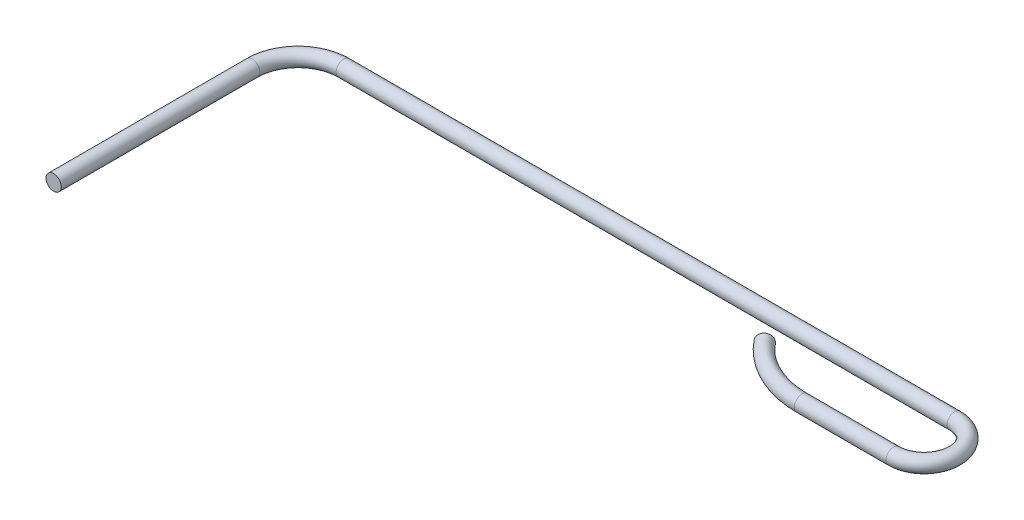
ISO-10303-21;
HEADER;
FILE_DESCRIPTION(('STEP AP214'),'2;1');
FILE_NAME('part.step','',(''),(''),'','','');
FILE_SCHEMA(('AUTOMOTIVE_DESIGN { 1 0 10303 214 1 1 1 1 }'));
ENDSEC;
DATA;
#1=APPLICATION_CONTEXT('core data for automotive mechanical design processes');
#2=APPLICATION_PROTOCOL_DEFINITION('international standard','automotive_design',2000,#1);
#3=PRODUCT_CONTEXT('',#1,'mechanical');
#4=PRODUCT('Part','Part','',(#3));
#5=PRODUCT_RELATED_PRODUCT_CATEGORY('part','',(#4));
#6=PRODUCT_DEFINITION_FORMATION('','',#4);
#7=PRODUCT_DEFINITION_CONTEXT('part definition',#1,'design');
#8=PRODUCT_DEFINITION('design','',#6,#7);
#9=PRODUCT_DEFINITION_SHAPE('','',#8);
#10=(LENGTH_UNIT() NAMED_UNIT(*) SI_UNIT(.MILLI.,.METRE.));
#11=(NAMED_UNIT(*) PLANE_ANGLE_UNIT() SI_UNIT($,.RADIAN.));
#12=(NAMED_UNIT(*) SI_UNIT($,.STERADIAN.) SOLID_ANGLE_UNIT());
#13=UNCERTAINTY_MEASURE_WITH_UNIT(LENGTH_MEASURE(1.E-05),#10,'distance_accuracy_value','');
#14=(GEOMETRIC_REPRESENTATION_CONTEXT(3) GLOBAL_UNCERTAINTY_ASSIGNED_CONTEXT((#13)) GLOBAL_UNIT_ASSIGNED_CONTEXT((#10,
#11,#12)) REPRESENTATION_CONTEXT('',''));
#15=CARTESIAN_POINT('',(0.,0.,0.));
#16=DIRECTION('',(0.,0.,1.));
#17=DIRECTION('',(1.,0.,0.));
#18=AXIS2_PLACEMENT_3D('',#15,#16,#17);
#19=CARTESIAN_POINT('',(0.,0.,0.));
#20=DIRECTION('',(0.,0.,1.));
#21=DIRECTION('',(1.,0.,0.));
#22=AXIS2_PLACEMENT_3D('',#19,#20,#21);
#23=PLANE('',#22);
#24=CARTESIAN_POINT('',(0.,0.,0.));
#25=DIRECTION('',(0.,0.,1.));
#26=DIRECTION('',(1.,0.,0.));
#27=AXIS2_PLACEMENT_3D('',#24,#25,#26);
#28=CIRCLE('',#27,2.5);
#29=CARTESIAN_POINT('',(2.5,0.,0.));
#30=VERTEX_POINT('',#29);
#31=EDGE_CURVE('E56',#30,#30,#28,.T.);
#32=ORIENTED_EDGE('',*,*,#31,.T.);
#33=EDGE_LOOP('',(#32));
#34=FACE_BOUND('',#33,.T.);
#35=ADVANCED_FACE('F31',(#34),#23,.T.);
#36=CARTESIAN_POINT('',(161.616073533188,0.,-71.2065973545311));
#37=DIRECTION('',(0.626446754848964,0.,0.779464215560408));
#38=DIRECTION('',(0.779464215560407,0.,-0.626446754848964));
#39=AXIS2_PLACEMENT_3D('',#36,#37,#38);
#40=PLANE('',#39);
#41=CARTESIAN_POINT('',(161.616073533188,0.,-71.2065973545311));
#42=DIRECTION('',(0.626446754848964,0.,0.779464215560408));
#43=DIRECTION('',(0.779464215560407,0.,-0.626446754848964));
#44=AXIS2_PLACEMENT_3D('',#41,#42,#43);
#45=CIRCLE('',#44,2.5);
#46=CARTESIAN_POINT('',(159.667412994287,0.,-69.6404804674086));
#47=VERTEX_POINT('',#46);
#48=EDGE_CURVE('E10',#47,#47,#45,.T.);
#49=ORIENTED_EDGE('',*,*,#48,.F.);
#50=EDGE_LOOP('',(#49));
#51=FACE_BOUND('',#50,.T.);
#52=ADVANCED_FACE('F64',(#51),#40,.F.);
#53=CARTESIAN_POINT('',(0.,0.,0.));
#54=DIRECTION('',(0.,0.,-1.));
#55=DIRECTION('',(-1.,0.,0.));
#56=AXIS2_PLACEMENT_3D('',#53,#54,#55);
#57=CYLINDRICAL_SURFACE('',#56,2.5);
#58=CARTESIAN_POINT('',(0.,0.,-65.));
#59=DIRECTION('',(0.,0.,1.));
#60=DIRECTION('',(1.,0.,0.));
#61=AXIS2_PLACEMENT_3D('',#58,#59,#60);
#62=CIRCLE('',#61,2.5);
#63=CARTESIAN_POINT('',(-2.5,0.,-65.));
#64=VERTEX_POINT('',#63);
#65=EDGE_CURVE('E53',#64,#64,#62,.T.);
#66=ORIENTED_EDGE('',*,*,#65,.T.);
#67=EDGE_LOOP('',(#66));
#68=FACE_BOUND('',#67,.T.);
#69=ORIENTED_EDGE('',*,*,#31,.F.);
#70=EDGE_LOOP('',(#69));
#71=FACE_BOUND('',#70,.T.);
#72=ADVANCED_FACE('F61',(#68,#71),#57,.T.);
#73=CARTESIAN_POINT('',(15.,0.,-65.));
#74=DIRECTION('',(0.,-1.,0.));
#75=DIRECTION('',(0.,0.,-1.));
#76=AXIS2_PLACEMENT_3D('',#73,#74,#75);
#77=TOROIDAL_SURFACE('',#76,15.,2.5);
#78=CARTESIAN_POINT('',(15.,0.,-80.));
#79=DIRECTION('',(-1.,0.,0.));
#80=DIRECTION('',(0.,0.,1.));
#81=AXIS2_PLACEMENT_3D('',#78,#79,#80);
#82=CIRCLE('',#81,2.5);
#83=CARTESIAN_POINT('',(15.,0.,-82.5));
#84=VERTEX_POINT('',#83);
#85=EDGE_CURVE('E50',#84,#84,#82,.T.);
#86=CARTESIAN_POINT('',(15.,0.,-65.));
#87=DIRECTION('',(0.,-1.,0.));
#88=DIRECTION('',(0.,0.,-1.));
#89=AXIS2_PLACEMENT_3D('',#86,#87,#88);
#90=CIRCLE('',#89,17.5);
#91=EDGE_CURVE('',#64,#84,#90,.T.);
#92=ORIENTED_EDGE('',*,*,#65,.F.);
#93=ORIENTED_EDGE('',*,*,#85,.T.);
#94=ORIENTED_EDGE('',*,*,#91,.T.);
#95=ORIENTED_EDGE('',*,*,#91,.F.);
#96=EDGE_LOOP('',(#92,#94,#93,#95));
#97=FACE_BOUND('',#96,.T.);
#98=ADVANCED_FACE('F63',(#97),#77,.T.);
#99=CARTESIAN_POINT('',(15.,0.,-80.));
#100=DIRECTION('',(1.,0.,0.));
#101=DIRECTION('',(0.,0.,-1.));
#102=AXIS2_PLACEMENT_3D('',#99,#100,#101);
#103=CYLINDRICAL_SURFACE('',#102,2.5);
#104=CARTESIAN_POINT('',(215.,0.,-80.));
#105=DIRECTION('',(-1.,0.,0.));
#106=DIRECTION('',(0.,0.,1.));
#107=AXIS2_PLACEMENT_3D('',#104,#105,#106);
#108=CIRCLE('',#107,2.5);
#109=CARTESIAN_POINT('',(215.,0.,-82.5));
#110=VERTEX_POINT('',#109);
#111=EDGE_CURVE('E45',#110,#110,#108,.T.);
#112=ORIENTED_EDGE('',*,*,#111,.T.);
#113=EDGE_LOOP('',(#112));
#114=FACE_BOUND('',#113,.T.);
#115=ORIENTED_EDGE('',*,*,#85,.F.);
#116=EDGE_LOOP('',(#115));
#117=FACE_BOUND('',#116,.T.);
#118=ADVANCED_FACE('F71',(#114,#117),#103,.T.);
#119=CARTESIAN_POINT('',(215.,0.,-70.));
#120=DIRECTION('',(0.,-1.,0.));
#121=DIRECTION('',(0.,0.,-1.));
#122=AXIS2_PLACEMENT_3D('',#119,#120,#121);
#123=TOROIDAL_SURFACE('',#122,9.99999999999999,2.5);
#124=CARTESIAN_POINT('',(215.,0.,-60.));
#125=DIRECTION('',(1.,0.,0.));
#126=DIRECTION('',(0.,0.,-1.));
#127=AXIS2_PLACEMENT_3D('',#124,#125,#126);
#128=CIRCLE('',#127,2.5);
#129=CARTESIAN_POINT('',(215.,0.,-57.5));
#130=VERTEX_POINT('',#129);
#131=EDGE_CURVE('E41',#130,#130,#128,.T.);
#132=CARTESIAN_POINT('',(215.,0.,-70.));
#133=DIRECTION('',(0.,-1.,0.));
#134=DIRECTION('',(0.,0.,-1.));
#135=AXIS2_PLACEMENT_3D('',#132,#133,#134);
#136=CIRCLE('',#135,12.5);
#137=EDGE_CURVE('',#110,#130,#136,.T.);
#138=ORIENTED_EDGE('',*,*,#111,.F.);
#139=ORIENTED_EDGE('',*,*,#131,.T.);
#140=ORIENTED_EDGE('',*,*,#137,.T.);
#141=ORIENTED_EDGE('',*,*,#137,.F.);
#142=EDGE_LOOP('',(#138,#140,#139,#141));
#143=FACE_BOUND('',#142,.T.);
#144=ADVANCED_FACE('F82',(#143),#123,.T.);
#145=CARTESIAN_POINT('',(215.,0.,-60.));
#146=DIRECTION('',(-1.,0.,0.));
#147=DIRECTION('',(0.,0.,1.));
#148=AXIS2_PLACEMENT_3D('',#145,#146,#147);
#149=CYLINDRICAL_SURFACE('',#148,2.5);
#150=CARTESIAN_POINT('',(185.,0.,-60.));
#151=DIRECTION('',(1.,0.,0.));
#152=DIRECTION('',(0.,0.,-1.));
#153=AXIS2_PLACEMENT_3D('',#150,#151,#152);
#154=CIRCLE('',#153,2.5);
#155=CARTESIAN_POINT('',(185.,0.,-57.5));
#156=VERTEX_POINT('',#155);
#157=EDGE_CURVE('E37',#156,#156,#154,.T.);
#158=ORIENTED_EDGE('',*,*,#157,.T.);
#159=EDGE_LOOP('',(#158));
#160=FACE_BOUND('',#159,.T.);
#161=ORIENTED_EDGE('',*,*,#131,.F.);
#162=EDGE_LOOP('',(#161));
#163=FACE_BOUND('',#162,.T.);
#164=ADVANCED_FACE('F77',(#160,#163),#149,.T.);
#165=CARTESIAN_POINT('',(185.,0.,-90.));
#166=DIRECTION('',(0.,-1.,0.));
#167=DIRECTION('',(0.,0.,-1.));
#168=AXIS2_PLACEMENT_3D('',#165,#166,#167);
#169=TOROIDAL_SURFACE('',#168,30.,2.5);
#170=CARTESIAN_POINT('',(185.,0.,-90.));
#171=DIRECTION('',(0.,-1.,0.));
#172=DIRECTION('',(0.,0.,-1.));
#173=AXIS2_PLACEMENT_3D('',#170,#171,#172);
#174=CIRCLE('',#173,32.5);
#175=EDGE_CURVE('',#156,#47,#174,.T.);
#176=ORIENTED_EDGE('',*,*,#157,.F.);
#177=ORIENTED_EDGE('',*,*,#48,.T.);
#178=ORIENTED_EDGE('',*,*,#175,.T.);
#179=ORIENTED_EDGE('',*,*,#175,.F.);
#180=EDGE_LOOP('',(#176,#178,#177,#179));
#181=FACE_BOUND('',#180,.T.);
#182=ADVANCED_FACE('F75',(#181),#169,.T.);
#183=CLOSED_SHELL('',(#35,#52,#72,#98,#118,#144,#164,#182));
#184=MANIFOLD_SOLID_BREP('B2',#183);
#185=ADVANCED_BREP_SHAPE_REPRESENTATION('',(#18,#184),#14);
#186=SHAPE_DEFINITION_REPRESENTATION(#9,#185);
ENDSEC;
END-ISO-10303-21;
